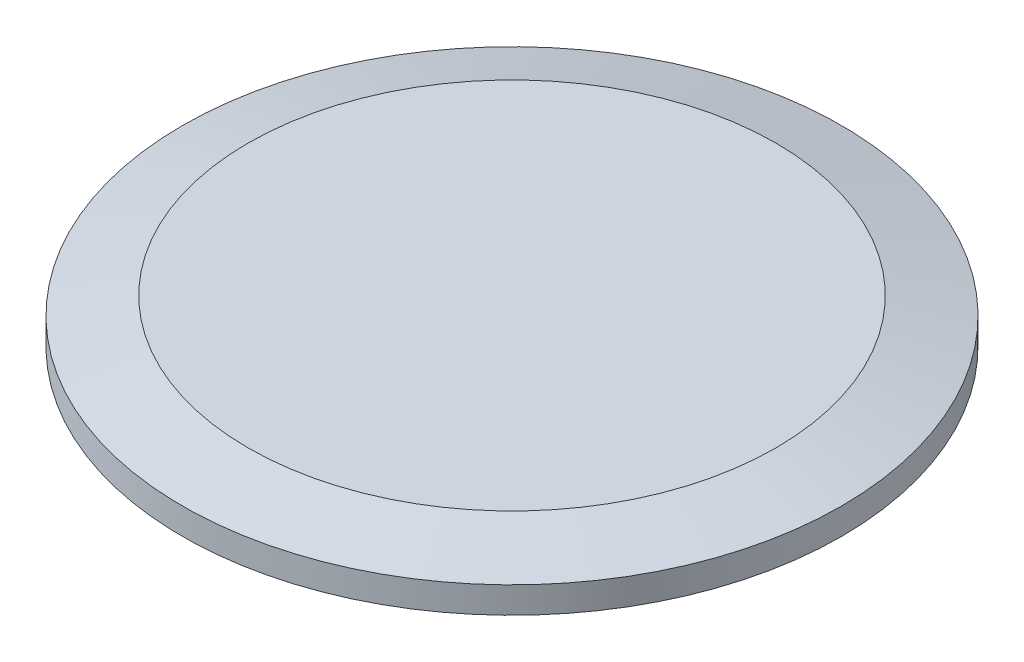
ISO-10303-21;
HEADER;
FILE_DESCRIPTION(('STEP AP214'),'2;1');
FILE_NAME('part.step','',(''),(''),'','','');
FILE_SCHEMA(('AUTOMOTIVE_DESIGN { 1 0 10303 214 1 1 1 1 }'));
ENDSEC;
DATA;
#1=APPLICATION_CONTEXT('core data for automotive mechanical design processes');
#2=APPLICATION_PROTOCOL_DEFINITION('international standard','automotive_design',2000,#1);
#3=PRODUCT_CONTEXT('',#1,'mechanical');
#4=PRODUCT('Part','Part','',(#3));
#5=PRODUCT_RELATED_PRODUCT_CATEGORY('part','',(#4));
#6=PRODUCT_DEFINITION_FORMATION('','',#4);
#7=PRODUCT_DEFINITION_CONTEXT('part definition',#1,'design');
#8=PRODUCT_DEFINITION('design','',#6,#7);
#9=PRODUCT_DEFINITION_SHAPE('','',#8);
#10=(LENGTH_UNIT() NAMED_UNIT(*) SI_UNIT(.MILLI.,.METRE.));
#11=(NAMED_UNIT(*) PLANE_ANGLE_UNIT() SI_UNIT($,.RADIAN.));
#12=(NAMED_UNIT(*) SI_UNIT($,.STERADIAN.) SOLID_ANGLE_UNIT());
#13=UNCERTAINTY_MEASURE_WITH_UNIT(LENGTH_MEASURE(1.E-05),#10,'distance_accuracy_value','');
#14=(GEOMETRIC_REPRESENTATION_CONTEXT(3) GLOBAL_UNCERTAINTY_ASSIGNED_CONTEXT((#13)) GLOBAL_UNIT_ASSIGNED_CONTEXT((#10,
#11,#12)) REPRESENTATION_CONTEXT('',''));
#15=CARTESIAN_POINT('',(0.,0.,0.));
#16=DIRECTION('',(0.,0.,1.));
#17=DIRECTION('',(1.,0.,0.));
#18=AXIS2_PLACEMENT_3D('',#15,#16,#17);
#19=CARTESIAN_POINT('',(0.,-5.,0.));
#20=DIRECTION('',(0.,-1.,0.));
#21=DIRECTION('',(0.,0.,-1.));
#22=AXIS2_PLACEMENT_3D('',#19,#20,#21);
#23=PLANE('',#22);
#24=CARTESIAN_POINT('',(0.,-5.,0.));
#25=DIRECTION('',(0.,1.,0.));
#26=DIRECTION('',(-1.,0.,0.));
#27=AXIS2_PLACEMENT_3D('',#24,#25,#26);
#28=CIRCLE('',#27,23.5);
#29=CARTESIAN_POINT('',(23.5,-5.,0.));
#30=VERTEX_POINT('',#29);
#31=EDGE_CURVE('E26',#30,#30,#28,.T.);
#32=ORIENTED_EDGE('',*,*,#31,.F.);
#33=EDGE_LOOP('',(#32));
#34=FACE_BOUND('',#33,.T.);
#35=ADVANCED_FACE('F17',(#34),#23,.T.);
#36=CARTESIAN_POINT('',(0.,0.25,0.));
#37=DIRECTION('',(0.,-1.,0.));
#38=DIRECTION('',(-1.,0.,0.));
#39=AXIS2_PLACEMENT_3D('',#36,#37,#38);
#40=CYLINDRICAL_SURFACE('',#39,23.5);
#41=ORIENTED_EDGE('',*,*,#31,.T.);
#42=DIRECTION('',(0.,1.,0.));
#43=VECTOR('',#42,1.);
#44=CARTESIAN_POINT('',(23.5,0.25,0.));
#45=LINE('',#44,#43);
#46=CARTESIAN_POINT('',(23.5,-2.,0.));
#47=VERTEX_POINT('',#46);
#48=EDGE_CURVE('E11',#30,#47,#45,.T.);
#49=ORIENTED_EDGE('',*,*,#48,.T.);
#50=CARTESIAN_POINT('',(0.,-2.,0.));
#51=DIRECTION('',(0.,-1.,0.));
#52=DIRECTION('',(-1.,0.,0.));
#53=AXIS2_PLACEMENT_3D('',#50,#51,#52);
#54=CIRCLE('',#53,23.5);
#55=EDGE_CURVE('E81',#47,#47,#54,.T.);
#56=ORIENTED_EDGE('',*,*,#55,.T.);
#57=ORIENTED_EDGE('',*,*,#48,.F.);
#58=EDGE_LOOP('',(#41,#49,#56,#57));
#59=FACE_BOUND('',#58,.T.);
#60=ADVANCED_FACE('F102',(#59),#40,.T.);
#61=CARTESIAN_POINT('',(0.,-2.,0.));
#62=DIRECTION('',(0.,-1.,0.));
#63=DIRECTION('',(0.,0.,-1.));
#64=AXIS2_PLACEMENT_3D('',#61,#62,#63);
#65=PLANE('',#64);
#66=ORIENTED_EDGE('',*,*,#55,.F.);
#67=EDGE_LOOP('',(#66));
#68=FACE_BOUND('',#67,.T.);
#69=CARTESIAN_POINT('',(0.,-2.,0.));
#70=DIRECTION('',(0.,1.,0.));
#71=DIRECTION('',(-1.,0.,0.));
#72=AXIS2_PLACEMENT_3D('',#69,#70,#71);
#73=CIRCLE('',#72,26.1);
#74=CARTESIAN_POINT('',(26.1,-2.,0.));
#75=VERTEX_POINT('',#74);
#76=EDGE_CURVE('E79',#75,#75,#73,.T.);
#77=ORIENTED_EDGE('',*,*,#76,.F.);
#78=EDGE_LOOP('',(#77));
#79=FACE_BOUND('',#78,.T.);
#80=ADVANCED_FACE('F110',(#68,#79),#65,.T.);
#81=CARTESIAN_POINT('',(0.,0.25,0.));
#82=DIRECTION('',(0.,-1.,0.));
#83=DIRECTION('',(-1.,0.,0.));
#84=AXIS2_PLACEMENT_3D('',#81,#82,#83);
#85=CYLINDRICAL_SURFACE('',#84,26.1);
#86=ORIENTED_EDGE('',*,*,#76,.T.);
#87=DIRECTION('',(0.,-1.,0.));
#88=VECTOR('',#87,1.);
#89=CARTESIAN_POINT('',(26.1,0.25,0.));
#90=LINE('',#89,#88);
#91=CARTESIAN_POINT('',(26.1,-5.,0.));
#92=VERTEX_POINT('',#91);
#93=EDGE_CURVE('E75',#75,#92,#90,.T.);
#94=ORIENTED_EDGE('',*,*,#93,.T.);
#95=CARTESIAN_POINT('',(0.,-5.,0.));
#96=DIRECTION('',(0.,-1.,0.));
#97=DIRECTION('',(-1.,0.,0.));
#98=AXIS2_PLACEMENT_3D('',#95,#96,#97);
#99=CIRCLE('',#98,26.1);
#100=EDGE_CURVE('E77',#92,#92,#99,.T.);
#101=ORIENTED_EDGE('',*,*,#100,.T.);
#102=ORIENTED_EDGE('',*,*,#93,.F.);
#103=EDGE_LOOP('',(#86,#94,#101,#102));
#104=FACE_BOUND('',#103,.T.);
#105=ADVANCED_FACE('F19',(#104),#85,.F.);
#106=CARTESIAN_POINT('',(0.,-5.,0.));
#107=DIRECTION('',(0.,-1.,0.));
#108=DIRECTION('',(0.,0.,-1.));
#109=AXIS2_PLACEMENT_3D('',#106,#107,#108);
#110=PLANE('',#109);
#111=ORIENTED_EDGE('',*,*,#100,.F.);
#112=EDGE_LOOP('',(#111));
#113=FACE_BOUND('',#112,.T.);
#114=CARTESIAN_POINT('',(0.,-5.,0.));
#115=DIRECTION('',(0.,1.,0.));
#116=DIRECTION('',(-1.,0.,0.));
#117=AXIS2_PLACEMENT_3D('',#114,#115,#116);
#118=CIRCLE('',#117,37.5);
#119=CARTESIAN_POINT('',(37.5,-5.,0.));
#120=VERTEX_POINT('',#119);
#121=EDGE_CURVE('E95',#120,#120,#118,.T.);
#122=ORIENTED_EDGE('',*,*,#121,.F.);
#123=EDGE_LOOP('',(#122));
#124=FACE_BOUND('',#123,.T.);
#125=ADVANCED_FACE('F124',(#113,#124),#110,.T.);
#126=CARTESIAN_POINT('',(0.,0.25,0.));
#127=DIRECTION('',(0.,-1.,0.));
#128=DIRECTION('',(-1.,0.,0.));
#129=AXIS2_PLACEMENT_3D('',#126,#127,#128);
#130=CYLINDRICAL_SURFACE('',#129,37.5);
#131=ORIENTED_EDGE('',*,*,#121,.T.);
#132=DIRECTION('',(0.,1.,0.));
#133=VECTOR('',#132,1.);
#134=CARTESIAN_POINT('',(37.5,0.25,0.));
#135=LINE('',#134,#133);
#136=CARTESIAN_POINT('',(37.5,-2.,0.));
#137=VERTEX_POINT('',#136);
#138=EDGE_CURVE('E66',#120,#137,#135,.T.);
#139=ORIENTED_EDGE('',*,*,#138,.T.);
#140=CARTESIAN_POINT('',(0.,-2.,0.));
#141=DIRECTION('',(0.,1.,0.));
#142=DIRECTION('',(-1.,0.,0.));
#143=AXIS2_PLACEMENT_3D('',#140,#141,#142);
#144=CIRCLE('',#143,37.5);
#145=EDGE_CURVE('E96',#137,#137,#144,.T.);
#146=ORIENTED_EDGE('',*,*,#145,.F.);
#147=ORIENTED_EDGE('',*,*,#138,.F.);
#148=EDGE_LOOP('',(#131,#139,#146,#147));
#149=FACE_BOUND('',#148,.T.);
#150=ADVANCED_FACE('F122',(#149),#130,.T.);
#151=CARTESIAN_POINT('',(0.,-1.,0.));
#152=DIRECTION('',(0.,-1.,0.));
#153=DIRECTION('',(-1.,0.,0.));
#154=AXIS2_PLACEMENT_3D('',#151,#152,#153);
#155=CONICAL_SURFACE('',#154,33.76794919243,1.30899693899575);
#156=ORIENTED_EDGE('',*,*,#145,.T.);
#157=DIRECTION('',(-0.965925826289068,0.258819045102521,0.));
#158=VECTOR('',#157,1.);
#159=CARTESIAN_POINT('',(33.76794919243,-1.,0.));
#160=LINE('',#159,#158);
#161=CARTESIAN_POINT('',(30.03589838486,0.,0.));
#162=VERTEX_POINT('',#161);
#163=EDGE_CURVE('E56',#137,#162,#160,.T.);
#164=ORIENTED_EDGE('',*,*,#163,.T.);
#165=CARTESIAN_POINT('',(0.,0.,0.));
#166=DIRECTION('',(0.,1.,0.));
#167=DIRECTION('',(-1.,0.,0.));
#168=AXIS2_PLACEMENT_3D('',#165,#166,#167);
#169=CIRCLE('',#168,30.03589838486);
#170=EDGE_CURVE('E143',#162,#162,#169,.T.);
#171=ORIENTED_EDGE('',*,*,#170,.F.);
#172=ORIENTED_EDGE('',*,*,#163,.F.);
#173=EDGE_LOOP('',(#156,#164,#171,#172));
#174=FACE_BOUND('',#173,.T.);
#175=ADVANCED_FACE('F114',(#174),#155,.T.);
#176=CARTESIAN_POINT('',(0.,0.,0.));
#177=DIRECTION('',(0.,-1.,0.));
#178=DIRECTION('',(0.,0.,-1.));
#179=AXIS2_PLACEMENT_3D('',#176,#177,#178);
#180=PLANE('',#179);
#181=ORIENTED_EDGE('',*,*,#170,.T.);
#182=EDGE_LOOP('',(#181));
#183=FACE_BOUND('',#182,.T.);
#184=ADVANCED_FACE('F116',(#183),#180,.F.);
#185=CLOSED_SHELL('',(#35,#60,#80,#105,#125,#150,#175,#184));
#186=MANIFOLD_SOLID_BREP('B1',#185);
#187=ADVANCED_BREP_SHAPE_REPRESENTATION('',(#18,#186),#14);
#188=SHAPE_DEFINITION_REPRESENTATION(#9,#187);
ENDSEC;
END-ISO-10303-21;
